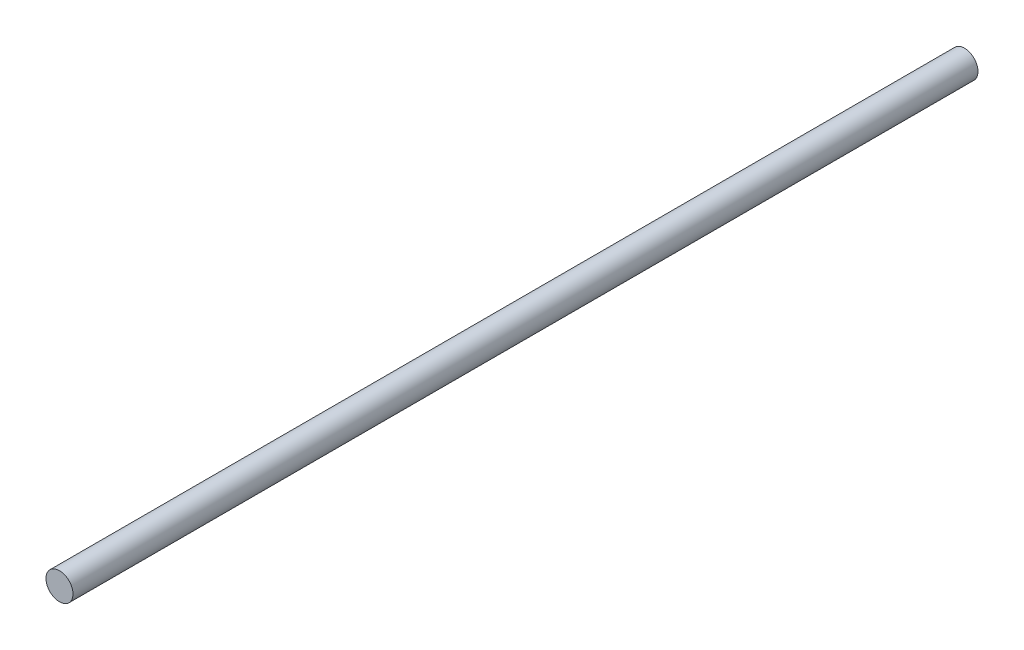
ISO-10303-21;
HEADER;
FILE_DESCRIPTION(('STEP AP214'),'2;1');
FILE_NAME('part.step','',(''),(''),'','','');
FILE_SCHEMA(('AUTOMOTIVE_DESIGN { 1 0 10303 214 1 1 1 1 }'));
ENDSEC;
DATA;
#1=APPLICATION_CONTEXT('core data for automotive mechanical design processes');
#2=APPLICATION_PROTOCOL_DEFINITION('international standard','automotive_design',2000,#1);
#3=PRODUCT_CONTEXT('',#1,'mechanical');
#4=PRODUCT('Part','Part','',(#3));
#5=PRODUCT_RELATED_PRODUCT_CATEGORY('part','',(#4));
#6=PRODUCT_DEFINITION_FORMATION('','',#4);
#7=PRODUCT_DEFINITION_CONTEXT('part definition',#1,'design');
#8=PRODUCT_DEFINITION('design','',#6,#7);
#9=PRODUCT_DEFINITION_SHAPE('','',#8);
#10=(LENGTH_UNIT() NAMED_UNIT(*) SI_UNIT(.MILLI.,.METRE.));
#11=(NAMED_UNIT(*) PLANE_ANGLE_UNIT() SI_UNIT($,.RADIAN.));
#12=(NAMED_UNIT(*) SI_UNIT($,.STERADIAN.) SOLID_ANGLE_UNIT());
#13=UNCERTAINTY_MEASURE_WITH_UNIT(LENGTH_MEASURE(1.E-05),#10,'distance_accuracy_value','');
#14=(GEOMETRIC_REPRESENTATION_CONTEXT(3) GLOBAL_UNCERTAINTY_ASSIGNED_CONTEXT((#13)) GLOBAL_UNIT_ASSIGNED_CONTEXT((#10,
#11,#12)) REPRESENTATION_CONTEXT('',''));
#15=CARTESIAN_POINT('',(0.,0.,0.));
#16=DIRECTION('',(0.,0.,1.));
#17=DIRECTION('',(1.,0.,0.));
#18=AXIS2_PLACEMENT_3D('',#15,#16,#17);
#19=CARTESIAN_POINT('',(0.,0.,268.));
#20=DIRECTION('',(0.,0.,-1.));
#21=DIRECTION('',(-1.,0.,0.));
#22=AXIS2_PLACEMENT_3D('',#19,#20,#21);
#23=CYLINDRICAL_SURFACE('',#22,4.);
#24=CARTESIAN_POINT('',(0.,0.,268.));
#25=DIRECTION('',(0.,0.,1.));
#26=DIRECTION('',(1.,0.,0.));
#27=AXIS2_PLACEMENT_3D('',#24,#25,#26);
#28=CIRCLE('',#27,4.);
#29=CARTESIAN_POINT('',(4.,0.,268.));
#30=VERTEX_POINT('',#29);
#31=EDGE_CURVE('E10',#30,#30,#28,.T.);
#32=ORIENTED_EDGE('',*,*,#31,.F.);
#33=EDGE_LOOP('',(#32));
#34=FACE_BOUND('',#33,.T.);
#35=CARTESIAN_POINT('',(0.,0.,0.));
#36=DIRECTION('',(0.,0.,1.));
#37=DIRECTION('',(1.,0.,0.));
#38=AXIS2_PLACEMENT_3D('',#35,#36,#37);
#39=CIRCLE('',#38,4.);
#40=CARTESIAN_POINT('',(4.,0.,0.));
#41=VERTEX_POINT('',#40);
#42=EDGE_CURVE('E31',#41,#41,#39,.T.);
#43=ORIENTED_EDGE('',*,*,#42,.T.);
#44=EDGE_LOOP('',(#43));
#45=FACE_BOUND('',#44,.T.);
#46=ADVANCED_FACE('F28',(#34,#45),#23,.T.);
#47=CARTESIAN_POINT('',(0.,0.,268.));
#48=DIRECTION('',(0.,0.,1.));
#49=DIRECTION('',(1.,0.,0.));
#50=AXIS2_PLACEMENT_3D('',#47,#48,#49);
#51=PLANE('',#50);
#52=ORIENTED_EDGE('',*,*,#31,.T.);
#53=EDGE_LOOP('',(#52));
#54=FACE_BOUND('',#53,.T.);
#55=ADVANCED_FACE('F43',(#54),#51,.T.);
#56=CARTESIAN_POINT('',(0.,0.,0.));
#57=DIRECTION('',(0.,0.,1.));
#58=DIRECTION('',(1.,0.,0.));
#59=AXIS2_PLACEMENT_3D('',#56,#57,#58);
#60=PLANE('',#59);
#61=ORIENTED_EDGE('',*,*,#42,.F.);
#62=EDGE_LOOP('',(#61));
#63=FACE_BOUND('',#62,.T.);
#64=ADVANCED_FACE('F41',(#63),#60,.F.);
#65=CLOSED_SHELL('',(#46,#55,#64));
#66=MANIFOLD_SOLID_BREP('B2',#65);
#67=ADVANCED_BREP_SHAPE_REPRESENTATION('',(#18,#66),#14);
#68=SHAPE_DEFINITION_REPRESENTATION(#9,#67);
ENDSEC;
END-ISO-10303-21;
